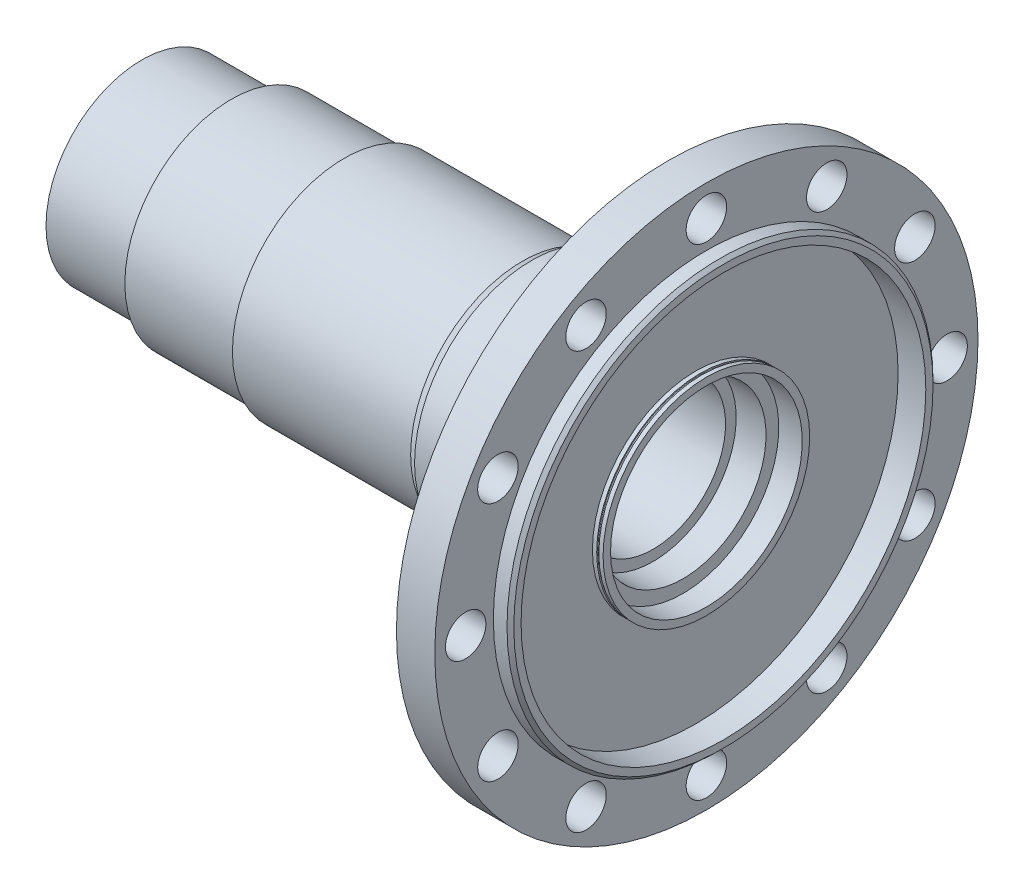
ISO-10303-21;
HEADER;
FILE_DESCRIPTION(('STEP AP214'),'2;1');
FILE_NAME('part.step','',(''),(''),'','','');
FILE_SCHEMA(('AUTOMOTIVE_DESIGN { 1 0 10303 214 1 1 1 1 }'));
ENDSEC;
DATA;
#1=APPLICATION_CONTEXT('core data for automotive mechanical design processes');
#2=APPLICATION_PROTOCOL_DEFINITION('international standard','automotive_design',2000,#1);
#3=PRODUCT_CONTEXT('',#1,'mechanical');
#4=PRODUCT('Part','Part','',(#3));
#5=PRODUCT_RELATED_PRODUCT_CATEGORY('part','',(#4));
#6=PRODUCT_DEFINITION_FORMATION('','',#4);
#7=PRODUCT_DEFINITION_CONTEXT('part definition',#1,'design');
#8=PRODUCT_DEFINITION('design','',#6,#7);
#9=PRODUCT_DEFINITION_SHAPE('','',#8);
#10=(LENGTH_UNIT() NAMED_UNIT(*) SI_UNIT(.MILLI.,.METRE.));
#11=(NAMED_UNIT(*) PLANE_ANGLE_UNIT() SI_UNIT($,.RADIAN.));
#12=(NAMED_UNIT(*) SI_UNIT($,.STERADIAN.) SOLID_ANGLE_UNIT());
#13=UNCERTAINTY_MEASURE_WITH_UNIT(LENGTH_MEASURE(1.E-05),#10,'distance_accuracy_value','');
#14=(GEOMETRIC_REPRESENTATION_CONTEXT(3) GLOBAL_UNCERTAINTY_ASSIGNED_CONTEXT((#13)) GLOBAL_UNIT_ASSIGNED_CONTEXT((#10,
#11,#12)) REPRESENTATION_CONTEXT('',''));
#15=CARTESIAN_POINT('',(0.,0.,0.));
#16=DIRECTION('',(0.,0.,1.));
#17=DIRECTION('',(1.,0.,0.));
#18=AXIS2_PLACEMENT_3D('',#15,#16,#17);
#19=CARTESIAN_POINT('',(265.,45.,0.));
#20=DIRECTION('',(1.,0.,0.));
#21=DIRECTION('',(0.,0.,-1.));
#22=AXIS2_PLACEMENT_3D('',#19,#20,#21);
#23=PLANE('',#22);
#24=CARTESIAN_POINT('',(265.,0.,0.));
#25=DIRECTION('',(-1.,0.,0.));
#26=DIRECTION('',(0.,0.,1.));
#27=AXIS2_PLACEMENT_3D('',#24,#25,#26);
#28=CIRCLE('',#27,45.);
#29=CARTESIAN_POINT('',(265.,0.,45.));
#30=VERTEX_POINT('',#29);
#31=EDGE_CURVE('E198',#30,#30,#28,.T.);
#32=ORIENTED_EDGE('',*,*,#31,.T.);
#33=EDGE_LOOP('',(#32));
#34=FACE_BOUND('',#33,.T.);
#35=CARTESIAN_POINT('',(265.,0.,0.));
#36=DIRECTION('',(-1.,0.,0.));
#37=DIRECTION('',(0.,0.,1.));
#38=AXIS2_PLACEMENT_3D('',#35,#36,#37);
#39=CIRCLE('',#38,48.5);
#40=CARTESIAN_POINT('',(265.,0.,48.5));
#41=VERTEX_POINT('',#40);
#42=EDGE_CURVE('E237',#41,#41,#39,.T.);
#43=ORIENTED_EDGE('',*,*,#42,.F.);
#44=EDGE_LOOP('',(#43));
#45=FACE_BOUND('',#44,.T.);
#46=ADVANCED_FACE('F50',(#34,#45),#23,.T.);
#47=CARTESIAN_POINT('',(0.,0.,0.));
#48=DIRECTION('',(1.,0.,0.));
#49=DIRECTION('',(0.,0.,-1.));
#50=AXIS2_PLACEMENT_3D('',#47,#48,#49);
#51=PLANE('',#50);
#52=CARTESIAN_POINT('',(0.,0.,0.));
#53=DIRECTION('',(-1.,0.,0.));
#54=DIRECTION('',(0.,0.,1.));
#55=AXIS2_PLACEMENT_3D('',#52,#53,#54);
#56=CIRCLE('',#55,31.);
#57=CARTESIAN_POINT('',(0.,0.,31.));
#58=VERTEX_POINT('',#57);
#59=EDGE_CURVE('E159',#58,#58,#56,.T.);
#60=ORIENTED_EDGE('',*,*,#59,.F.);
#61=EDGE_LOOP('',(#60));
#62=FACE_BOUND('',#61,.T.);
#63=CARTESIAN_POINT('',(0.,0.,0.));
#64=DIRECTION('',(-1.,0.,0.));
#65=DIRECTION('',(0.,0.,1.));
#66=AXIS2_PLACEMENT_3D('',#63,#64,#65);
#67=CIRCLE('',#66,45.);
#68=CARTESIAN_POINT('',(0.,0.,45.));
#69=VERTEX_POINT('',#68);
#70=EDGE_CURVE('E11',#69,#69,#67,.T.);
#71=ORIENTED_EDGE('',*,*,#70,.T.);
#72=EDGE_LOOP('',(#71));
#73=FACE_BOUND('',#72,.T.);
#74=ADVANCED_FACE('F53',(#62,#73),#51,.F.);
#75=CARTESIAN_POINT('',(0.,0.,0.));
#76=DIRECTION('',(-1.,0.,0.));
#77=DIRECTION('',(0.,0.,1.));
#78=AXIS2_PLACEMENT_3D('',#75,#76,#77);
#79=CYLINDRICAL_SURFACE('',#78,45.);
#80=ORIENTED_EDGE('',*,*,#70,.F.);
#81=EDGE_LOOP('',(#80));
#82=FACE_BOUND('',#81,.T.);
#83=CARTESIAN_POINT('',(42.,0.,0.));
#84=DIRECTION('',(-1.,0.,0.));
#85=DIRECTION('',(0.,0.,1.));
#86=AXIS2_PLACEMENT_3D('',#83,#84,#85);
#87=CIRCLE('',#86,45.);
#88=CARTESIAN_POINT('',(42.,0.,45.));
#89=VERTEX_POINT('',#88);
#90=EDGE_CURVE('E60',#89,#89,#87,.T.);
#91=ORIENTED_EDGE('',*,*,#90,.T.);
#92=EDGE_LOOP('',(#91));
#93=FACE_BOUND('',#92,.T.);
#94=ADVANCED_FACE('F380',(#82,#93),#79,.T.);
#95=CARTESIAN_POINT('',(42.,45.,0.));
#96=DIRECTION('',(1.,0.,0.));
#97=DIRECTION('',(0.,0.,-1.));
#98=AXIS2_PLACEMENT_3D('',#95,#96,#97);
#99=PLANE('',#98);
#100=ORIENTED_EDGE('',*,*,#90,.F.);
#101=EDGE_LOOP('',(#100));
#102=FACE_BOUND('',#101,.T.);
#103=CARTESIAN_POINT('',(42.,0.,0.));
#104=DIRECTION('',(-1.,0.,0.));
#105=DIRECTION('',(0.,0.,1.));
#106=AXIS2_PLACEMENT_3D('',#103,#104,#105);
#107=CIRCLE('',#106,50.);
#108=CARTESIAN_POINT('',(42.,0.,50.));
#109=VERTEX_POINT('',#108);
#110=EDGE_CURVE('E66',#109,#109,#107,.T.);
#111=ORIENTED_EDGE('',*,*,#110,.T.);
#112=EDGE_LOOP('',(#111));
#113=FACE_BOUND('',#112,.T.);
#114=ADVANCED_FACE('F456',(#102,#113),#99,.F.);
#115=CARTESIAN_POINT('',(0.,0.,0.));
#116=DIRECTION('',(-1.,0.,0.));
#117=DIRECTION('',(0.,0.,1.));
#118=AXIS2_PLACEMENT_3D('',#115,#116,#117);
#119=CYLINDRICAL_SURFACE('',#118,50.);
#120=ORIENTED_EDGE('',*,*,#110,.F.);
#121=EDGE_LOOP('',(#120));
#122=FACE_BOUND('',#121,.T.);
#123=CARTESIAN_POINT('',(95.,0.,0.));
#124=DIRECTION('',(-1.,0.,0.));
#125=DIRECTION('',(0.,0.,1.));
#126=AXIS2_PLACEMENT_3D('',#123,#124,#125);
#127=CIRCLE('',#126,50.);
#128=CARTESIAN_POINT('',(95.,0.,50.));
#129=VERTEX_POINT('',#128);
#130=EDGE_CURVE('E83',#129,#129,#127,.T.);
#131=ORIENTED_EDGE('',*,*,#130,.T.);
#132=EDGE_LOOP('',(#131));
#133=FACE_BOUND('',#132,.T.);
#134=ADVANCED_FACE('F453',(#122,#133),#119,.T.);
#135=CARTESIAN_POINT('',(95.,50.,0.));
#136=DIRECTION('',(1.,0.,0.));
#137=DIRECTION('',(0.,0.,-1.));
#138=AXIS2_PLACEMENT_3D('',#135,#136,#137);
#139=PLANE('',#138);
#140=ORIENTED_EDGE('',*,*,#130,.F.);
#141=EDGE_LOOP('',(#140));
#142=FACE_BOUND('',#141,.T.);
#143=CARTESIAN_POINT('',(95.,0.,0.));
#144=DIRECTION('',(-1.,0.,0.));
#145=DIRECTION('',(0.,0.,1.));
#146=AXIS2_PLACEMENT_3D('',#143,#144,#145);
#147=CIRCLE('',#146,52.5);
#148=CARTESIAN_POINT('',(95.,0.,52.5));
#149=VERTEX_POINT('',#148);
#150=EDGE_CURVE('E88',#149,#149,#147,.T.);
#151=ORIENTED_EDGE('',*,*,#150,.T.);
#152=EDGE_LOOP('',(#151));
#153=FACE_BOUND('',#152,.T.);
#154=ADVANCED_FACE('F450',(#142,#153),#139,.F.);
#155=CARTESIAN_POINT('',(0.,0.,0.));
#156=DIRECTION('',(-1.,0.,0.));
#157=DIRECTION('',(0.,0.,1.));
#158=AXIS2_PLACEMENT_3D('',#155,#156,#157);
#159=CYLINDRICAL_SURFACE('',#158,52.5);
#160=ORIENTED_EDGE('',*,*,#150,.F.);
#161=EDGE_LOOP('',(#160));
#162=FACE_BOUND('',#161,.T.);
#163=CARTESIAN_POINT('',(178.669872981078,0.,0.));
#164=DIRECTION('',(-1.,0.,0.));
#165=DIRECTION('',(0.,0.,1.));
#166=AXIS2_PLACEMENT_3D('',#163,#164,#165);
#167=CIRCLE('',#166,52.5);
#168=CARTESIAN_POINT('',(178.669872981078,0.,52.5));
#169=VERTEX_POINT('',#168);
#170=EDGE_CURVE('E93',#169,#169,#167,.T.);
#171=ORIENTED_EDGE('',*,*,#170,.T.);
#172=EDGE_LOOP('',(#171));
#173=FACE_BOUND('',#172,.T.);
#174=ADVANCED_FACE('F447',(#162,#173),#159,.T.);
#175=CARTESIAN_POINT('',(183.,0.,0.));
#176=DIRECTION('',(1.,0.,0.));
#177=DIRECTION('',(0.,0.,-1.));
#178=AXIS2_PLACEMENT_3D('',#175,#176,#177);
#179=CONICAL_SURFACE('',#178,55.,0.5235987755983);
#180=ORIENTED_EDGE('',*,*,#170,.F.);
#181=EDGE_LOOP('',(#180));
#182=FACE_BOUND('',#181,.T.);
#183=CARTESIAN_POINT('',(183.,0.,0.));
#184=DIRECTION('',(-1.,0.,0.));
#185=DIRECTION('',(0.,0.,1.));
#186=AXIS2_PLACEMENT_3D('',#183,#184,#185);
#187=CIRCLE('',#186,55.);
#188=CARTESIAN_POINT('',(183.,0.,55.));
#189=VERTEX_POINT('',#188);
#190=EDGE_CURVE('E101',#189,#189,#187,.T.);
#191=ORIENTED_EDGE('',*,*,#190,.T.);
#192=EDGE_LOOP('',(#191));
#193=FACE_BOUND('',#192,.T.);
#194=ADVANCED_FACE('F444',(#182,#193),#179,.T.);
#195=CARTESIAN_POINT('',(0.,0.,0.));
#196=DIRECTION('',(-1.,0.,0.));
#197=DIRECTION('',(0.,0.,1.));
#198=AXIS2_PLACEMENT_3D('',#195,#196,#197);
#199=CYLINDRICAL_SURFACE('',#198,55.);
#200=ORIENTED_EDGE('',*,*,#190,.F.);
#201=EDGE_LOOP('',(#200));
#202=FACE_BOUND('',#201,.T.);
#203=CARTESIAN_POINT('',(215.,0.,0.));
#204=DIRECTION('',(-1.,0.,0.));
#205=DIRECTION('',(0.,0.,1.));
#206=AXIS2_PLACEMENT_3D('',#203,#204,#205);
#207=CIRCLE('',#206,55.);
#208=CARTESIAN_POINT('',(215.,0.,55.));
#209=VERTEX_POINT('',#208);
#210=EDGE_CURVE('E105',#209,#209,#207,.T.);
#211=ORIENTED_EDGE('',*,*,#210,.T.);
#212=EDGE_LOOP('',(#211));
#213=FACE_BOUND('',#212,.T.);
#214=ADVANCED_FACE('F441',(#202,#213),#199,.T.);
#215=CARTESIAN_POINT('',(215.,55.,0.));
#216=DIRECTION('',(1.,0.,0.));
#217=DIRECTION('',(0.,0.,-1.));
#218=AXIS2_PLACEMENT_3D('',#215,#216,#217);
#219=PLANE('',#218);
#220=ORIENTED_EDGE('',*,*,#210,.F.);
#221=EDGE_LOOP('',(#220));
#222=FACE_BOUND('',#221,.T.);
#223=CARTESIAN_POINT('',(215.,0.,0.));
#224=DIRECTION('',(-1.,0.,0.));
#225=DIRECTION('',(0.,0.,1.));
#226=AXIS2_PLACEMENT_3D('',#223,#224,#225);
#227=CIRCLE('',#226,62.5);
#228=CARTESIAN_POINT('',(215.,0.,62.5));
#229=VERTEX_POINT('',#228);
#230=EDGE_CURVE('E110',#229,#229,#227,.T.);
#231=ORIENTED_EDGE('',*,*,#230,.T.);
#232=EDGE_LOOP('',(#231));
#233=FACE_BOUND('',#232,.T.);
#234=ADVANCED_FACE('F438',(#222,#233),#219,.F.);
#235=CARTESIAN_POINT('',(0.,0.,0.));
#236=DIRECTION('',(-1.,0.,0.));
#237=DIRECTION('',(0.,0.,1.));
#238=AXIS2_PLACEMENT_3D('',#235,#236,#237);
#239=CYLINDRICAL_SURFACE('',#238,62.5);
#240=ORIENTED_EDGE('',*,*,#230,.F.);
#241=EDGE_LOOP('',(#240));
#242=FACE_BOUND('',#241,.T.);
#243=CARTESIAN_POINT('',(239.,0.,0.));
#244=DIRECTION('',(-1.,0.,0.));
#245=DIRECTION('',(0.,0.,1.));
#246=AXIS2_PLACEMENT_3D('',#243,#244,#245);
#247=CIRCLE('',#246,62.5);
#248=CARTESIAN_POINT('',(239.,0.,62.5));
#249=VERTEX_POINT('',#248);
#250=EDGE_CURVE('E115',#249,#249,#247,.T.);
#251=ORIENTED_EDGE('',*,*,#250,.T.);
#252=EDGE_LOOP('',(#251));
#253=FACE_BOUND('',#252,.T.);
#254=ADVANCED_FACE('F435',(#242,#253),#239,.T.);
#255=CARTESIAN_POINT('',(239.,62.5,0.));
#256=DIRECTION('',(1.,0.,0.));
#257=DIRECTION('',(0.,0.,-1.));
#258=AXIS2_PLACEMENT_3D('',#255,#256,#257);
#259=PLANE('',#258);
#260=ORIENTED_EDGE('',*,*,#250,.F.);
#261=EDGE_LOOP('',(#260));
#262=FACE_BOUND('',#261,.T.);
#263=CARTESIAN_POINT('',(239.,0.,0.));
#264=DIRECTION('',(-1.,0.,0.));
#265=DIRECTION('',(0.,0.,1.));
#266=AXIS2_PLACEMENT_3D('',#263,#264,#265);
#267=CIRCLE('',#266,100.);
#268=CARTESIAN_POINT('',(239.,0.,100.));
#269=VERTEX_POINT('',#268);
#270=EDGE_CURVE('E123',#269,#269,#267,.T.);
#271=ORIENTED_EDGE('',*,*,#270,.T.);
#272=EDGE_LOOP('',(#271));
#273=FACE_BOUND('',#272,.T.);
#274=ADVANCED_FACE('F432',(#262,#273),#259,.F.);
#275=CARTESIAN_POINT('',(0.,0.,0.));
#276=DIRECTION('',(-1.,0.,0.));
#277=DIRECTION('',(0.,0.,1.));
#278=AXIS2_PLACEMENT_3D('',#275,#276,#277);
#279=CYLINDRICAL_SURFACE('',#278,100.);
#280=ORIENTED_EDGE('',*,*,#270,.F.);
#281=EDGE_LOOP('',(#280));
#282=FACE_BOUND('',#281,.T.);
#283=CARTESIAN_POINT('',(247.,0.,0.));
#284=DIRECTION('',(-1.,0.,0.));
#285=DIRECTION('',(0.,0.,1.));
#286=AXIS2_PLACEMENT_3D('',#283,#284,#285);
#287=CIRCLE('',#286,100.);
#288=CARTESIAN_POINT('',(247.,0.,100.));
#289=VERTEX_POINT('',#288);
#290=EDGE_CURVE('E127',#289,#289,#287,.T.);
#291=ORIENTED_EDGE('',*,*,#290,.T.);
#292=EDGE_LOOP('',(#291));
#293=FACE_BOUND('',#292,.T.);
#294=ADVANCED_FACE('F429',(#282,#293),#279,.T.);
#295=CARTESIAN_POINT('',(247.,100.,0.));
#296=DIRECTION('',(1.,0.,0.));
#297=DIRECTION('',(0.,0.,-1.));
#298=AXIS2_PLACEMENT_3D('',#295,#296,#297);
#299=PLANE('',#298);
#300=CARTESIAN_POINT('',(247.,97.8608706276416,-56.5));
#301=DIRECTION('',(1.,0.,0.));
#302=DIRECTION('',(0.,0.,-1.));
#303=AXIS2_PLACEMENT_3D('',#300,#301,#302);
#304=CIRCLE('',#303,9.5);
#305=CARTESIAN_POINT('',(247.,97.8608706276416,-66.));
#306=VERTEX_POINT('',#305);
#307=EDGE_CURVE('E296',#306,#306,#304,.F.);
#308=ORIENTED_EDGE('',*,*,#307,.F.);
#309=EDGE_LOOP('',(#308));
#310=FACE_BOUND('',#309,.T.);
#311=CARTESIAN_POINT('',(247.,56.4999999999999,-97.8608706276416));
#312=DIRECTION('',(1.,0.,0.));
#313=DIRECTION('',(0.,0.,-1.));
#314=AXIS2_PLACEMENT_3D('',#311,#312,#313);
#315=CIRCLE('',#314,9.49999999999999);
#316=CARTESIAN_POINT('',(247.,56.4999999999999,-107.360870627642));
#317=VERTEX_POINT('',#316);
#318=EDGE_CURVE('E291',#317,#317,#315,.F.);
#319=ORIENTED_EDGE('',*,*,#318,.F.);
#320=EDGE_LOOP('',(#319));
#321=FACE_BOUND('',#320,.T.);
#322=CARTESIAN_POINT('',(247.,0.,-113.));
#323=DIRECTION('',(1.,0.,0.));
#324=DIRECTION('',(0.,0.,-1.));
#325=AXIS2_PLACEMENT_3D('',#322,#323,#324);
#326=CIRCLE('',#325,9.49999999999999);
#327=CARTESIAN_POINT('',(247.,0.,-122.5));
#328=VERTEX_POINT('',#327);
#329=EDGE_CURVE('E286',#328,#328,#326,.F.);
#330=ORIENTED_EDGE('',*,*,#329,.F.);
#331=EDGE_LOOP('',(#330));
#332=FACE_BOUND('',#331,.T.);
#333=CARTESIAN_POINT('',(247.,-56.5,-97.8608706276415));
#334=DIRECTION('',(1.,0.,0.));
#335=DIRECTION('',(0.,0.,-1.));
#336=AXIS2_PLACEMENT_3D('',#333,#334,#335);
#337=CIRCLE('',#336,9.49999999999999);
#338=CARTESIAN_POINT('',(247.,-56.5,-107.360870627642));
#339=VERTEX_POINT('',#338);
#340=EDGE_CURVE('E281',#339,#339,#337,.F.);
#341=ORIENTED_EDGE('',*,*,#340,.F.);
#342=EDGE_LOOP('',(#341));
#343=FACE_BOUND('',#342,.T.);
#344=CARTESIAN_POINT('',(247.,-97.8608706276416,-56.5));
#345=DIRECTION('',(1.,0.,0.));
#346=DIRECTION('',(0.,0.,-1.));
#347=AXIS2_PLACEMENT_3D('',#344,#345,#346);
#348=CIRCLE('',#347,9.5);
#349=CARTESIAN_POINT('',(247.,-97.8608706276416,-66.));
#350=VERTEX_POINT('',#349);
#351=EDGE_CURVE('E276',#350,#350,#348,.F.);
#352=ORIENTED_EDGE('',*,*,#351,.F.);
#353=EDGE_LOOP('',(#352));
#354=FACE_BOUND('',#353,.T.);
#355=CARTESIAN_POINT('',(247.,-113.,0.));
#356=DIRECTION('',(1.,0.,0.));
#357=DIRECTION('',(0.,0.,-1.));
#358=AXIS2_PLACEMENT_3D('',#355,#356,#357);
#359=CIRCLE('',#358,9.5);
#360=CARTESIAN_POINT('',(247.,-113.,-9.49999999999998));
#361=VERTEX_POINT('',#360);
#362=EDGE_CURVE('E271',#361,#361,#359,.F.);
#363=ORIENTED_EDGE('',*,*,#362,.F.);
#364=EDGE_LOOP('',(#363));
#365=FACE_BOUND('',#364,.T.);
#366=CARTESIAN_POINT('',(247.,-97.8608706276415,56.5));
#367=DIRECTION('',(1.,0.,0.));
#368=DIRECTION('',(0.,0.,-1.));
#369=AXIS2_PLACEMENT_3D('',#366,#367,#368);
#370=CIRCLE('',#369,9.5);
#371=CARTESIAN_POINT('',(247.,-97.8608706276415,47.));
#372=VERTEX_POINT('',#371);
#373=EDGE_CURVE('E266',#372,#372,#370,.F.);
#374=ORIENTED_EDGE('',*,*,#373,.F.);
#375=EDGE_LOOP('',(#374));
#376=FACE_BOUND('',#375,.T.);
#377=CARTESIAN_POINT('',(247.,-56.5,97.8608706276416));
#378=DIRECTION('',(1.,0.,0.));
#379=DIRECTION('',(0.,0.,-1.));
#380=AXIS2_PLACEMENT_3D('',#377,#378,#379);
#381=CIRCLE('',#380,9.49999999999999);
#382=CARTESIAN_POINT('',(247.,-56.5,88.3608706276416));
#383=VERTEX_POINT('',#382);
#384=EDGE_CURVE('E261',#383,#383,#381,.F.);
#385=ORIENTED_EDGE('',*,*,#384,.F.);
#386=EDGE_LOOP('',(#385));
#387=FACE_BOUND('',#386,.T.);
#388=CARTESIAN_POINT('',(247.,0.,113.));
#389=DIRECTION('',(1.,0.,0.));
#390=DIRECTION('',(0.,0.,-1.));
#391=AXIS2_PLACEMENT_3D('',#388,#389,#390);
#392=CIRCLE('',#391,9.49999999999999);
#393=CARTESIAN_POINT('',(247.,0.,103.5));
#394=VERTEX_POINT('',#393);
#395=EDGE_CURVE('E256',#394,#394,#392,.F.);
#396=ORIENTED_EDGE('',*,*,#395,.F.);
#397=EDGE_LOOP('',(#396));
#398=FACE_BOUND('',#397,.T.);
#399=CARTESIAN_POINT('',(247.,56.5,97.8608706276416));
#400=DIRECTION('',(1.,0.,0.));
#401=DIRECTION('',(0.,0.,-1.));
#402=AXIS2_PLACEMENT_3D('',#399,#400,#401);
#403=CIRCLE('',#402,9.49999999999999);
#404=CARTESIAN_POINT('',(247.,56.5,88.3608706276416));
#405=VERTEX_POINT('',#404);
#406=EDGE_CURVE('E251',#405,#405,#403,.F.);
#407=ORIENTED_EDGE('',*,*,#406,.F.);
#408=EDGE_LOOP('',(#407));
#409=FACE_BOUND('',#408,.T.);
#410=CARTESIAN_POINT('',(247.,97.8608706276416,56.5));
#411=DIRECTION('',(1.,0.,0.));
#412=DIRECTION('',(0.,0.,-1.));
#413=AXIS2_PLACEMENT_3D('',#410,#411,#412);
#414=CIRCLE('',#413,9.5);
#415=CARTESIAN_POINT('',(247.,97.8608706276416,47.));
#416=VERTEX_POINT('',#415);
#417=EDGE_CURVE('E246',#416,#416,#414,.F.);
#418=ORIENTED_EDGE('',*,*,#417,.F.);
#419=EDGE_LOOP('',(#418));
#420=FACE_BOUND('',#419,.T.);
#421=CARTESIAN_POINT('',(247.,113.,0.));
#422=DIRECTION('',(1.,0.,0.));
#423=DIRECTION('',(0.,0.,-1.));
#424=AXIS2_PLACEMENT_3D('',#421,#422,#423);
#425=CIRCLE('',#424,9.5);
#426=CARTESIAN_POINT('',(247.,113.,-9.50000000000001));
#427=VERTEX_POINT('',#426);
#428=EDGE_CURVE('E242',#427,#427,#425,.F.);
#429=ORIENTED_EDGE('',*,*,#428,.F.);
#430=EDGE_LOOP('',(#429));
#431=FACE_BOUND('',#430,.T.);
#432=ORIENTED_EDGE('',*,*,#290,.F.);
#433=EDGE_LOOP('',(#432));
#434=FACE_BOUND('',#433,.T.);
#435=CARTESIAN_POINT('',(247.,0.,0.));
#436=DIRECTION('',(-1.,0.,0.));
#437=DIRECTION('',(0.,0.,1.));
#438=AXIS2_PLACEMENT_3D('',#435,#436,#437);
#439=CIRCLE('',#438,127.5);
#440=CARTESIAN_POINT('',(247.,0.,127.5));
#441=VERTEX_POINT('',#440);
#442=EDGE_CURVE('E132',#441,#441,#439,.T.);
#443=ORIENTED_EDGE('',*,*,#442,.T.);
#444=EDGE_LOOP('',(#443));
#445=FACE_BOUND('',#444,.T.);
#446=ADVANCED_FACE('F426',(#310,#321,#332,#343,#354,#365,#376,#387,#398,#409,#420,#431,#434,
#445),#299,.F.);
#447=CARTESIAN_POINT('',(0.,0.,0.));
#448=DIRECTION('',(-1.,0.,0.));
#449=DIRECTION('',(0.,0.,1.));
#450=AXIS2_PLACEMENT_3D('',#447,#448,#449);
#451=CYLINDRICAL_SURFACE('',#450,127.5);
#452=ORIENTED_EDGE('',*,*,#442,.F.);
#453=EDGE_LOOP('',(#452));
#454=FACE_BOUND('',#453,.T.);
#455=CARTESIAN_POINT('',(265.,0.,0.));
#456=DIRECTION('',(-1.,0.,0.));
#457=DIRECTION('',(0.,0.,1.));
#458=AXIS2_PLACEMENT_3D('',#455,#456,#457);
#459=CIRCLE('',#458,127.5);
#460=CARTESIAN_POINT('',(265.,0.,127.5));
#461=VERTEX_POINT('',#460);
#462=EDGE_CURVE('E137',#461,#461,#459,.T.);
#463=ORIENTED_EDGE('',*,*,#462,.T.);
#464=EDGE_LOOP('',(#463));
#465=FACE_BOUND('',#464,.T.);
#466=ADVANCED_FACE('F313',(#454,#465),#451,.T.);
#467=CARTESIAN_POINT('',(265.,127.5,0.));
#468=DIRECTION('',(-1.,0.,0.));
#469=DIRECTION('',(0.,0.,1.));
#470=AXIS2_PLACEMENT_3D('',#467,#468,#469);
#471=PLANE('',#470);
#472=CARTESIAN_POINT('',(265.,97.8608706276416,-56.5));
#473=DIRECTION('',(-1.,0.,0.));
#474=DIRECTION('',(0.,0.,1.));
#475=AXIS2_PLACEMENT_3D('',#472,#473,#474);
#476=CIRCLE('',#475,9.5);
#477=CARTESIAN_POINT('',(265.,97.8608706276416,-47.));
#478=VERTEX_POINT('',#477);
#479=EDGE_CURVE('E55',#478,#478,#476,.F.);
#480=ORIENTED_EDGE('',*,*,#479,.F.);
#481=EDGE_LOOP('',(#480));
#482=FACE_BOUND('',#481,.T.);
#483=CARTESIAN_POINT('',(265.,56.4999999999999,-97.8608706276416));
#484=DIRECTION('',(-1.,0.,0.));
#485=DIRECTION('',(0.,0.,1.));
#486=AXIS2_PLACEMENT_3D('',#483,#484,#485);
#487=CIRCLE('',#486,9.49999999999999);
#488=CARTESIAN_POINT('',(265.,56.4999999999999,-88.3608706276416));
#489=VERTEX_POINT('',#488);
#490=EDGE_CURVE('E295',#489,#489,#487,.F.);
#491=ORIENTED_EDGE('',*,*,#490,.F.);
#492=EDGE_LOOP('',(#491));
#493=FACE_BOUND('',#492,.T.);
#494=CARTESIAN_POINT('',(265.,0.,-113.));
#495=DIRECTION('',(-1.,0.,0.));
#496=DIRECTION('',(0.,0.,1.));
#497=AXIS2_PLACEMENT_3D('',#494,#495,#496);
#498=CIRCLE('',#497,9.49999999999999);
#499=CARTESIAN_POINT('',(265.,0.,-103.5));
#500=VERTEX_POINT('',#499);
#501=EDGE_CURVE('E290',#500,#500,#498,.F.);
#502=ORIENTED_EDGE('',*,*,#501,.F.);
#503=EDGE_LOOP('',(#502));
#504=FACE_BOUND('',#503,.T.);
#505=CARTESIAN_POINT('',(265.,-56.5,-97.8608706276415));
#506=DIRECTION('',(-1.,0.,0.));
#507=DIRECTION('',(0.,0.,1.));
#508=AXIS2_PLACEMENT_3D('',#505,#506,#507);
#509=CIRCLE('',#508,9.49999999999999);
#510=CARTESIAN_POINT('',(265.,-56.5,-88.3608706276415));
#511=VERTEX_POINT('',#510);
#512=EDGE_CURVE('E285',#511,#511,#509,.F.);
#513=ORIENTED_EDGE('',*,*,#512,.F.);
#514=EDGE_LOOP('',(#513));
#515=FACE_BOUND('',#514,.T.);
#516=CARTESIAN_POINT('',(265.,-97.8608706276416,-56.5));
#517=DIRECTION('',(-1.,0.,0.));
#518=DIRECTION('',(0.,0.,1.));
#519=AXIS2_PLACEMENT_3D('',#516,#517,#518);
#520=CIRCLE('',#519,9.5);
#521=CARTESIAN_POINT('',(265.,-97.8608706276416,-47.));
#522=VERTEX_POINT('',#521);
#523=EDGE_CURVE('E280',#522,#522,#520,.F.);
#524=ORIENTED_EDGE('',*,*,#523,.F.);
#525=EDGE_LOOP('',(#524));
#526=FACE_BOUND('',#525,.T.);
#527=CARTESIAN_POINT('',(265.,-113.,0.));
#528=DIRECTION('',(-1.,0.,0.));
#529=DIRECTION('',(0.,0.,1.));
#530=AXIS2_PLACEMENT_3D('',#527,#528,#529);
#531=CIRCLE('',#530,9.5);
#532=CARTESIAN_POINT('',(265.,-113.,9.50000000000002));
#533=VERTEX_POINT('',#532);
#534=EDGE_CURVE('E275',#533,#533,#531,.F.);
#535=ORIENTED_EDGE('',*,*,#534,.F.);
#536=EDGE_LOOP('',(#535));
#537=FACE_BOUND('',#536,.T.);
#538=CARTESIAN_POINT('',(265.,-97.8608706276415,56.5));
#539=DIRECTION('',(-1.,0.,0.));
#540=DIRECTION('',(0.,0.,1.));
#541=AXIS2_PLACEMENT_3D('',#538,#539,#540);
#542=CIRCLE('',#541,9.5);
#543=CARTESIAN_POINT('',(265.,-97.8608706276415,66.0000000000001));
#544=VERTEX_POINT('',#543);
#545=EDGE_CURVE('E270',#544,#544,#542,.F.);
#546=ORIENTED_EDGE('',*,*,#545,.F.);
#547=EDGE_LOOP('',(#546));
#548=FACE_BOUND('',#547,.T.);
#549=CARTESIAN_POINT('',(265.,-56.5,97.8608706276416));
#550=DIRECTION('',(-1.,0.,0.));
#551=DIRECTION('',(0.,0.,1.));
#552=AXIS2_PLACEMENT_3D('',#549,#550,#551);
#553=CIRCLE('',#552,9.49999999999999);
#554=CARTESIAN_POINT('',(265.,-56.5,107.360870627642));
#555=VERTEX_POINT('',#554);
#556=EDGE_CURVE('E265',#555,#555,#553,.F.);
#557=ORIENTED_EDGE('',*,*,#556,.F.);
#558=EDGE_LOOP('',(#557));
#559=FACE_BOUND('',#558,.T.);
#560=CARTESIAN_POINT('',(265.,0.,113.));
#561=DIRECTION('',(-1.,0.,0.));
#562=DIRECTION('',(0.,0.,1.));
#563=AXIS2_PLACEMENT_3D('',#560,#561,#562);
#564=CIRCLE('',#563,9.49999999999999);
#565=CARTESIAN_POINT('',(265.,0.,122.5));
#566=VERTEX_POINT('',#565);
#567=EDGE_CURVE('E260',#566,#566,#564,.F.);
#568=ORIENTED_EDGE('',*,*,#567,.F.);
#569=EDGE_LOOP('',(#568));
#570=FACE_BOUND('',#569,.T.);
#571=CARTESIAN_POINT('',(265.,56.5,97.8608706276416));
#572=DIRECTION('',(-1.,0.,0.));
#573=DIRECTION('',(0.,0.,1.));
#574=AXIS2_PLACEMENT_3D('',#571,#572,#573);
#575=CIRCLE('',#574,9.49999999999999);
#576=CARTESIAN_POINT('',(265.,56.5,107.360870627642));
#577=VERTEX_POINT('',#576);
#578=EDGE_CURVE('E255',#577,#577,#575,.F.);
#579=ORIENTED_EDGE('',*,*,#578,.F.);
#580=EDGE_LOOP('',(#579));
#581=FACE_BOUND('',#580,.T.);
#582=CARTESIAN_POINT('',(265.,97.8608706276416,56.5));
#583=DIRECTION('',(-1.,0.,0.));
#584=DIRECTION('',(0.,0.,1.));
#585=AXIS2_PLACEMENT_3D('',#582,#583,#584);
#586=CIRCLE('',#585,9.5);
#587=CARTESIAN_POINT('',(265.,97.8608706276416,66.));
#588=VERTEX_POINT('',#587);
#589=EDGE_CURVE('E250',#588,#588,#586,.F.);
#590=ORIENTED_EDGE('',*,*,#589,.F.);
#591=EDGE_LOOP('',(#590));
#592=FACE_BOUND('',#591,.T.);
#593=CARTESIAN_POINT('',(265.,113.,0.));
#594=DIRECTION('',(-1.,0.,0.));
#595=DIRECTION('',(0.,0.,1.));
#596=AXIS2_PLACEMENT_3D('',#593,#594,#595);
#597=CIRCLE('',#596,9.5);
#598=CARTESIAN_POINT('',(265.,113.,9.49999999999999));
#599=VERTEX_POINT('',#598);
#600=EDGE_CURVE('E72',#599,#599,#597,.F.);
#601=ORIENTED_EDGE('',*,*,#600,.F.);
#602=EDGE_LOOP('',(#601));
#603=FACE_BOUND('',#602,.T.);
#604=ORIENTED_EDGE('',*,*,#462,.F.);
#605=EDGE_LOOP('',(#604));
#606=FACE_BOUND('',#605,.T.);
#607=CARTESIAN_POINT('',(265.,0.,0.));
#608=DIRECTION('',(-1.,0.,0.));
#609=DIRECTION('',(0.,0.,1.));
#610=AXIS2_PLACEMENT_3D('',#607,#608,#609);
#611=CIRCLE('',#610,100.);
#612=CARTESIAN_POINT('',(265.,0.,100.));
#613=VERTEX_POINT('',#612);
#614=EDGE_CURVE('E145',#613,#613,#611,.T.);
#615=ORIENTED_EDGE('',*,*,#614,.T.);
#616=EDGE_LOOP('',(#615));
#617=FACE_BOUND('',#616,.T.);
#618=ADVANCED_FACE('F309',(#482,#493,#504,#515,#526,#537,#548,#559,#570,#581,#592,#603,#606,
#617),#471,.F.);
#619=CARTESIAN_POINT('',(0.,0.,0.));
#620=DIRECTION('',(-1.,0.,0.));
#621=DIRECTION('',(0.,0.,1.));
#622=AXIS2_PLACEMENT_3D('',#619,#620,#621);
#623=CYLINDRICAL_SURFACE('',#622,100.);
#624=ORIENTED_EDGE('',*,*,#614,.F.);
#625=EDGE_LOOP('',(#624));
#626=FACE_BOUND('',#625,.T.);
#627=CARTESIAN_POINT('',(271.4,0.,0.));
#628=DIRECTION('',(-1.,0.,0.));
#629=DIRECTION('',(0.,0.,1.));
#630=AXIS2_PLACEMENT_3D('',#627,#628,#629);
#631=CIRCLE('',#630,100.);
#632=CARTESIAN_POINT('',(271.4,0.,100.));
#633=VERTEX_POINT('',#632);
#634=EDGE_CURVE('E149',#633,#633,#631,.T.);
#635=ORIENTED_EDGE('',*,*,#634,.T.);
#636=EDGE_LOOP('',(#635));
#637=FACE_BOUND('',#636,.T.);
#638=ADVANCED_FACE('F312',(#626,#637),#623,.T.);
#639=CARTESIAN_POINT('',(273.,0.,0.));
#640=DIRECTION('',(-1.,0.,0.));
#641=DIRECTION('',(0.,0.,1.));
#642=AXIS2_PLACEMENT_3D('',#639,#640,#641);
#643=CONICAL_SURFACE('',#642,98.4,0.785398163397435);
#644=ORIENTED_EDGE('',*,*,#634,.F.);
#645=EDGE_LOOP('',(#644));
#646=FACE_BOUND('',#645,.T.);
#647=CARTESIAN_POINT('',(273.,0.,0.));
#648=DIRECTION('',(-1.,0.,0.));
#649=DIRECTION('',(0.,0.,1.));
#650=AXIS2_PLACEMENT_3D('',#647,#648,#649);
#651=CIRCLE('',#650,98.4);
#652=CARTESIAN_POINT('',(273.,0.,98.4));
#653=VERTEX_POINT('',#652);
#654=EDGE_CURVE('E154',#653,#653,#651,.T.);
#655=ORIENTED_EDGE('',*,*,#654,.T.);
#656=EDGE_LOOP('',(#655));
#657=FACE_BOUND('',#656,.T.);
#658=ADVANCED_FACE('F354',(#646,#657),#643,.T.);
#659=CARTESIAN_POINT('',(273.,98.4,0.));
#660=DIRECTION('',(-1.,0.,0.));
#661=DIRECTION('',(0.,0.,1.));
#662=AXIS2_PLACEMENT_3D('',#659,#660,#661);
#663=PLANE('',#662);
#664=CARTESIAN_POINT('',(273.,0.,0.));
#665=DIRECTION('',(-1.,0.,0.));
#666=DIRECTION('',(0.,0.,1.));
#667=AXIS2_PLACEMENT_3D('',#664,#665,#666);
#668=CIRCLE('',#667,95.);
#669=CARTESIAN_POINT('',(273.,0.,95.));
#670=VERTEX_POINT('',#669);
#671=EDGE_CURVE('E203',#670,#670,#668,.T.);
#672=ORIENTED_EDGE('',*,*,#671,.T.);
#673=EDGE_LOOP('',(#672));
#674=FACE_BOUND('',#673,.T.);
#675=ORIENTED_EDGE('',*,*,#654,.F.);
#676=EDGE_LOOP('',(#675));
#677=FACE_BOUND('',#676,.T.);
#678=ADVANCED_FACE('F360',(#674,#677),#663,.F.);
#679=CARTESIAN_POINT('',(0.,0.,0.));
#680=DIRECTION('',(-1.,0.,0.));
#681=DIRECTION('',(0.,0.,1.));
#682=AXIS2_PLACEMENT_3D('',#679,#680,#681);
#683=CYLINDRICAL_SURFACE('',#682,31.);
#684=ORIENTED_EDGE('',*,*,#59,.T.);
#685=EDGE_LOOP('',(#684));
#686=FACE_BOUND('',#685,.T.);
#687=CARTESIAN_POINT('',(203.5,0.,0.));
#688=DIRECTION('',(-1.,0.,0.));
#689=DIRECTION('',(0.,0.,1.));
#690=AXIS2_PLACEMENT_3D('',#687,#688,#689);
#691=CIRCLE('',#690,31.);
#692=CARTESIAN_POINT('',(203.5,0.,31.));
#693=VERTEX_POINT('',#692);
#694=EDGE_CURVE('E167',#693,#693,#691,.T.);
#695=ORIENTED_EDGE('',*,*,#694,.F.);
#696=EDGE_LOOP('',(#695));
#697=FACE_BOUND('',#696,.T.);
#698=ADVANCED_FACE('F365',(#686,#697),#683,.F.);
#699=CARTESIAN_POINT('',(203.5,31.,0.));
#700=DIRECTION('',(1.,0.,0.));
#701=DIRECTION('',(0.,0.,-1.));
#702=AXIS2_PLACEMENT_3D('',#699,#700,#701);
#703=PLANE('',#702);
#704=ORIENTED_EDGE('',*,*,#694,.T.);
#705=EDGE_LOOP('',(#704));
#706=FACE_BOUND('',#705,.T.);
#707=CARTESIAN_POINT('',(203.5,0.,0.));
#708=DIRECTION('',(-1.,0.,0.));
#709=DIRECTION('',(0.,0.,1.));
#710=AXIS2_PLACEMENT_3D('',#707,#708,#709);
#711=CIRCLE('',#710,34.);
#712=CARTESIAN_POINT('',(203.5,0.,34.));
#713=VERTEX_POINT('',#712);
#714=EDGE_CURVE('E171',#713,#713,#711,.T.);
#715=ORIENTED_EDGE('',*,*,#714,.F.);
#716=EDGE_LOOP('',(#715));
#717=FACE_BOUND('',#716,.T.);
#718=ADVANCED_FACE('F370',(#706,#717),#703,.T.);
#719=CARTESIAN_POINT('',(0.,0.,0.));
#720=DIRECTION('',(-1.,0.,0.));
#721=DIRECTION('',(0.,0.,1.));
#722=AXIS2_PLACEMENT_3D('',#719,#720,#721);
#723=CYLINDRICAL_SURFACE('',#722,34.);
#724=ORIENTED_EDGE('',*,*,#714,.T.);
#725=EDGE_LOOP('',(#724));
#726=FACE_BOUND('',#725,.T.);
#727=CARTESIAN_POINT('',(240.,0.,0.));
#728=DIRECTION('',(-1.,0.,0.));
#729=DIRECTION('',(0.,0.,1.));
#730=AXIS2_PLACEMENT_3D('',#727,#728,#729);
#731=CIRCLE('',#730,34.);
#732=CARTESIAN_POINT('',(240.,0.,34.));
#733=VERTEX_POINT('',#732);
#734=EDGE_CURVE('E176',#733,#733,#731,.T.);
#735=ORIENTED_EDGE('',*,*,#734,.F.);
#736=EDGE_LOOP('',(#735));
#737=FACE_BOUND('',#736,.T.);
#738=ADVANCED_FACE('F409',(#726,#737),#723,.F.);
#739=CARTESIAN_POINT('',(240.,34.,0.));
#740=DIRECTION('',(1.,0.,0.));
#741=DIRECTION('',(0.,0.,-1.));
#742=AXIS2_PLACEMENT_3D('',#739,#740,#741);
#743=PLANE('',#742);
#744=ORIENTED_EDGE('',*,*,#734,.T.);
#745=EDGE_LOOP('',(#744));
#746=FACE_BOUND('',#745,.T.);
#747=CARTESIAN_POINT('',(240.,0.,0.));
#748=DIRECTION('',(-1.,0.,0.));
#749=DIRECTION('',(0.,0.,1.));
#750=AXIS2_PLACEMENT_3D('',#747,#748,#749);
#751=CIRCLE('',#750,39.);
#752=CARTESIAN_POINT('',(240.,0.,39.));
#753=VERTEX_POINT('',#752);
#754=EDGE_CURVE('E181',#753,#753,#751,.T.);
#755=ORIENTED_EDGE('',*,*,#754,.F.);
#756=EDGE_LOOP('',(#755));
#757=FACE_BOUND('',#756,.T.);
#758=ADVANCED_FACE('F404',(#746,#757),#743,.T.);
#759=CARTESIAN_POINT('',(0.,0.,0.));
#760=DIRECTION('',(-1.,0.,0.));
#761=DIRECTION('',(0.,0.,1.));
#762=AXIS2_PLACEMENT_3D('',#759,#760,#761);
#763=CYLINDRICAL_SURFACE('',#762,39.);
#764=ORIENTED_EDGE('',*,*,#754,.T.);
#765=EDGE_LOOP('',(#764));
#766=FACE_BOUND('',#765,.T.);
#767=CARTESIAN_POINT('',(254.,0.,0.));
#768=DIRECTION('',(-1.,0.,0.));
#769=DIRECTION('',(0.,0.,1.));
#770=AXIS2_PLACEMENT_3D('',#767,#768,#769);
#771=CIRCLE('',#770,39.);
#772=CARTESIAN_POINT('',(254.,0.,39.));
#773=VERTEX_POINT('',#772);
#774=EDGE_CURVE('E189',#773,#773,#771,.T.);
#775=ORIENTED_EDGE('',*,*,#774,.F.);
#776=EDGE_LOOP('',(#775));
#777=FACE_BOUND('',#776,.T.);
#778=ADVANCED_FACE('F399',(#766,#777),#763,.F.);
#779=CARTESIAN_POINT('',(254.,39.,0.));
#780=DIRECTION('',(1.,0.,0.));
#781=DIRECTION('',(0.,0.,-1.));
#782=AXIS2_PLACEMENT_3D('',#779,#780,#781);
#783=PLANE('',#782);
#784=ORIENTED_EDGE('',*,*,#774,.T.);
#785=EDGE_LOOP('',(#784));
#786=FACE_BOUND('',#785,.T.);
#787=CARTESIAN_POINT('',(254.,0.,0.));
#788=DIRECTION('',(-1.,0.,0.));
#789=DIRECTION('',(0.,0.,1.));
#790=AXIS2_PLACEMENT_3D('',#787,#788,#789);
#791=CIRCLE('',#790,45.);
#792=CARTESIAN_POINT('',(254.,0.,45.));
#793=VERTEX_POINT('',#792);
#794=EDGE_CURVE('E193',#793,#793,#791,.T.);
#795=ORIENTED_EDGE('',*,*,#794,.F.);
#796=EDGE_LOOP('',(#795));
#797=FACE_BOUND('',#796,.T.);
#798=ADVANCED_FACE('F394',(#786,#797),#783,.T.);
#799=CARTESIAN_POINT('',(0.,0.,0.));
#800=DIRECTION('',(-1.,0.,0.));
#801=DIRECTION('',(0.,0.,1.));
#802=AXIS2_PLACEMENT_3D('',#799,#800,#801);
#803=CYLINDRICAL_SURFACE('',#802,45.);
#804=ORIENTED_EDGE('',*,*,#794,.T.);
#805=EDGE_LOOP('',(#804));
#806=FACE_BOUND('',#805,.T.);
#807=ORIENTED_EDGE('',*,*,#31,.F.);
#808=EDGE_LOOP('',(#807));
#809=FACE_BOUND('',#808,.T.);
#810=ADVANCED_FACE('F390',(#806,#809),#803,.F.);
#811=CARTESIAN_POINT('',(0.,0.,0.));
#812=DIRECTION('',(-1.,0.,0.));
#813=DIRECTION('',(0.,0.,1.));
#814=AXIS2_PLACEMENT_3D('',#811,#812,#813);
#815=CYLINDRICAL_SURFACE('',#814,95.);
#816=ORIENTED_EDGE('',*,*,#671,.F.);
#817=EDGE_LOOP('',(#816));
#818=FACE_BOUND('',#817,.T.);
#819=CARTESIAN_POINT('',(260.,0.,0.));
#820=DIRECTION('',(-1.,0.,0.));
#821=DIRECTION('',(0.,0.,1.));
#822=AXIS2_PLACEMENT_3D('',#819,#820,#821);
#823=CIRCLE('',#822,95.);
#824=CARTESIAN_POINT('',(260.,0.,95.));
#825=VERTEX_POINT('',#824);
#826=EDGE_CURVE('E215',#825,#825,#823,.T.);
#827=ORIENTED_EDGE('',*,*,#826,.T.);
#828=EDGE_LOOP('',(#827));
#829=FACE_BOUND('',#828,.T.);
#830=ADVANCED_FACE('F387',(#818,#829),#815,.F.);
#831=CARTESIAN_POINT('',(0.,0.,0.));
#832=DIRECTION('',(-1.,0.,0.));
#833=DIRECTION('',(0.,0.,1.));
#834=AXIS2_PLACEMENT_3D('',#831,#832,#833);
#835=CYLINDRICAL_SURFACE('',#834,48.5);
#836=ORIENTED_EDGE('',*,*,#42,.T.);
#837=EDGE_LOOP('',(#836));
#838=FACE_BOUND('',#837,.T.);
#839=CARTESIAN_POINT('',(263.,0.,0.));
#840=DIRECTION('',(-1.,0.,0.));
#841=DIRECTION('',(0.,0.,1.));
#842=AXIS2_PLACEMENT_3D('',#839,#840,#841);
#843=CIRCLE('',#842,48.5);
#844=CARTESIAN_POINT('',(263.,0.,48.5));
#845=VERTEX_POINT('',#844);
#846=EDGE_CURVE('E233',#845,#845,#843,.T.);
#847=ORIENTED_EDGE('',*,*,#846,.F.);
#848=EDGE_LOOP('',(#847));
#849=FACE_BOUND('',#848,.T.);
#850=ADVANCED_FACE('F674',(#838,#849),#835,.T.);
#851=CARTESIAN_POINT('',(263.,48.,0.));
#852=DIRECTION('',(-1.,0.,0.));
#853=DIRECTION('',(0.,0.,1.));
#854=AXIS2_PLACEMENT_3D('',#851,#852,#853);
#855=PLANE('',#854);
#856=CARTESIAN_POINT('',(263.,0.,0.));
#857=DIRECTION('',(-1.,0.,0.));
#858=DIRECTION('',(0.,0.,1.));
#859=AXIS2_PLACEMENT_3D('',#856,#857,#858);
#860=CIRCLE('',#859,48.);
#861=CARTESIAN_POINT('',(263.,0.,48.));
#862=VERTEX_POINT('',#861);
#863=EDGE_CURVE('E224',#862,#862,#860,.T.);
#864=ORIENTED_EDGE('',*,*,#863,.F.);
#865=EDGE_LOOP('',(#864));
#866=FACE_BOUND('',#865,.T.);
#867=ORIENTED_EDGE('',*,*,#846,.T.);
#868=EDGE_LOOP('',(#867));
#869=FACE_BOUND('',#868,.T.);
#870=ADVANCED_FACE('F627',(#866,#869),#855,.T.);
#871=CARTESIAN_POINT('',(260.,95.,0.));
#872=DIRECTION('',(1.,0.,0.));
#873=DIRECTION('',(0.,0.,-1.));
#874=AXIS2_PLACEMENT_3D('',#871,#872,#873);
#875=PLANE('',#874);
#876=CARTESIAN_POINT('',(260.,0.,0.));
#877=DIRECTION('',(-1.,0.,0.));
#878=DIRECTION('',(0.,0.,1.));
#879=AXIS2_PLACEMENT_3D('',#876,#877,#878);
#880=CIRCLE('',#879,48.5);
#881=CARTESIAN_POINT('',(260.,0.,48.5));
#882=VERTEX_POINT('',#881);
#883=EDGE_CURVE('E211',#882,#882,#880,.T.);
#884=ORIENTED_EDGE('',*,*,#883,.T.);
#885=EDGE_LOOP('',(#884));
#886=FACE_BOUND('',#885,.T.);
#887=ORIENTED_EDGE('',*,*,#826,.F.);
#888=EDGE_LOOP('',(#887));
#889=FACE_BOUND('',#888,.T.);
#890=ADVANCED_FACE('F621',(#886,#889),#875,.T.);
#891=CARTESIAN_POINT('',(0.,0.,0.));
#892=DIRECTION('',(-1.,0.,0.));
#893=DIRECTION('',(0.,0.,1.));
#894=AXIS2_PLACEMENT_3D('',#891,#892,#893);
#895=CYLINDRICAL_SURFACE('',#894,48.5);
#896=CARTESIAN_POINT('',(262.,0.,0.));
#897=DIRECTION('',(1.,0.,0.));
#898=DIRECTION('',(0.,0.,-1.));
#899=AXIS2_PLACEMENT_3D('',#896,#897,#898);
#900=CIRCLE('',#899,48.5);
#901=CARTESIAN_POINT('',(262.,0.,-48.5));
#902=VERTEX_POINT('',#901);
#903=EDGE_CURVE('E220',#902,#902,#900,.F.);
#904=ORIENTED_EDGE('',*,*,#903,.T.);
#905=EDGE_LOOP('',(#904));
#906=FACE_BOUND('',#905,.T.);
#907=ORIENTED_EDGE('',*,*,#883,.F.);
#908=EDGE_LOOP('',(#907));
#909=FACE_BOUND('',#908,.T.);
#910=ADVANCED_FACE('F626',(#906,#909),#895,.T.);
#911=CARTESIAN_POINT('',(262.5,0.,0.));
#912=DIRECTION('',(-1.,0.,0.));
#913=DIRECTION('',(0.,0.,1.));
#914=AXIS2_PLACEMENT_3D('',#911,#912,#913);
#915=TOROIDAL_SURFACE('',#914,48.,0.500000000000004);
#916=ORIENTED_EDGE('',*,*,#863,.T.);
#917=EDGE_LOOP('',(#916));
#918=FACE_BOUND('',#917,.T.);
#919=CARTESIAN_POINT('',(262.,0.,0.));
#920=DIRECTION('',(-1.,0.,0.));
#921=DIRECTION('',(0.,0.,1.));
#922=AXIS2_PLACEMENT_3D('',#919,#920,#921);
#923=CIRCLE('',#922,48.);
#924=CARTESIAN_POINT('',(262.,0.,48.));
#925=VERTEX_POINT('',#924);
#926=EDGE_CURVE('E229',#925,#925,#923,.T.);
#927=ORIENTED_EDGE('',*,*,#926,.F.);
#928=EDGE_LOOP('',(#927));
#929=FACE_BOUND('',#928,.T.);
#930=ADVANCED_FACE('F637',(#918,#929),#915,.F.);
#931=CARTESIAN_POINT('',(262.,95.,0.));
#932=DIRECTION('',(1.,0.,0.));
#933=DIRECTION('',(0.,0.,-1.));
#934=AXIS2_PLACEMENT_3D('',#931,#932,#933);
#935=PLANE('',#934);
#936=ORIENTED_EDGE('',*,*,#903,.F.);
#937=EDGE_LOOP('',(#936));
#938=FACE_BOUND('',#937,.T.);
#939=ORIENTED_EDGE('',*,*,#926,.T.);
#940=EDGE_LOOP('',(#939));
#941=FACE_BOUND('',#940,.T.);
#942=ADVANCED_FACE('F648',(#938,#941),#935,.T.);
#943=CARTESIAN_POINT('',(273.,113.,0.));
#944=DIRECTION('',(-1.,0.,0.));
#945=DIRECTION('',(0.,0.,1.));
#946=AXIS2_PLACEMENT_3D('',#943,#944,#945);
#947=CYLINDRICAL_SURFACE('',#946,9.5);
#948=ORIENTED_EDGE('',*,*,#600,.T.);
#949=EDGE_LOOP('',(#948));
#950=FACE_BOUND('',#949,.T.);
#951=ORIENTED_EDGE('',*,*,#428,.T.);
#952=EDGE_LOOP('',(#951));
#953=FACE_BOUND('',#952,.T.);
#954=ADVANCED_FACE('F656',(#950,#953),#947,.F.);
#955=CARTESIAN_POINT('',(273.,97.8608706276416,56.5));
#956=DIRECTION('',(-1.,0.,0.));
#957=DIRECTION('',(0.,0.,1.));
#958=AXIS2_PLACEMENT_3D('',#955,#956,#957);
#959=CYLINDRICAL_SURFACE('',#958,9.5);
#960=ORIENTED_EDGE('',*,*,#589,.T.);
#961=EDGE_LOOP('',(#960));
#962=FACE_BOUND('',#961,.T.);
#963=ORIENTED_EDGE('',*,*,#417,.T.);
#964=EDGE_LOOP('',(#963));
#965=FACE_BOUND('',#964,.T.);
#966=ADVANCED_FACE('F695',(#962,#965),#959,.F.);
#967=CARTESIAN_POINT('',(273.,56.5,97.8608706276416));
#968=DIRECTION('',(-1.,0.,0.));
#969=DIRECTION('',(0.,0.,1.));
#970=AXIS2_PLACEMENT_3D('',#967,#968,#969);
#971=CYLINDRICAL_SURFACE('',#970,9.49999999999999);
#972=ORIENTED_EDGE('',*,*,#578,.T.);
#973=EDGE_LOOP('',(#972));
#974=FACE_BOUND('',#973,.T.);
#975=ORIENTED_EDGE('',*,*,#406,.T.);
#976=EDGE_LOOP('',(#975));
#977=FACE_BOUND('',#976,.T.);
#978=ADVANCED_FACE('F705',(#974,#977),#971,.F.);
#979=CARTESIAN_POINT('',(273.,0.,113.));
#980=DIRECTION('',(-1.,0.,0.));
#981=DIRECTION('',(0.,0.,1.));
#982=AXIS2_PLACEMENT_3D('',#979,#980,#981);
#983=CYLINDRICAL_SURFACE('',#982,9.49999999999999);
#984=ORIENTED_EDGE('',*,*,#567,.T.);
#985=EDGE_LOOP('',(#984));
#986=FACE_BOUND('',#985,.T.);
#987=ORIENTED_EDGE('',*,*,#395,.T.);
#988=EDGE_LOOP('',(#987));
#989=FACE_BOUND('',#988,.T.);
#990=ADVANCED_FACE('F715',(#986,#989),#983,.F.);
#991=CARTESIAN_POINT('',(273.,-56.5,97.8608706276416));
#992=DIRECTION('',(-1.,0.,0.));
#993=DIRECTION('',(0.,0.,1.));
#994=AXIS2_PLACEMENT_3D('',#991,#992,#993);
#995=CYLINDRICAL_SURFACE('',#994,9.49999999999999);
#996=ORIENTED_EDGE('',*,*,#556,.T.);
#997=EDGE_LOOP('',(#996));
#998=FACE_BOUND('',#997,.T.);
#999=ORIENTED_EDGE('',*,*,#384,.T.);
#1000=EDGE_LOOP('',(#999));
#1001=FACE_BOUND('',#1000,.T.);
#1002=ADVANCED_FACE('F725',(#998,#1001),#995,.F.);
#1003=CARTESIAN_POINT('',(273.,-97.8608706276415,56.5));
#1004=DIRECTION('',(-1.,0.,0.));
#1005=DIRECTION('',(0.,0.,1.));
#1006=AXIS2_PLACEMENT_3D('',#1003,#1004,#1005);
#1007=CYLINDRICAL_SURFACE('',#1006,9.5);
#1008=ORIENTED_EDGE('',*,*,#545,.T.);
#1009=EDGE_LOOP('',(#1008));
#1010=FACE_BOUND('',#1009,.T.);
#1011=ORIENTED_EDGE('',*,*,#373,.T.);
#1012=EDGE_LOOP('',(#1011));
#1013=FACE_BOUND('',#1012,.T.);
#1014=ADVANCED_FACE('F735',(#1010,#1013),#1007,.F.);
#1015=CARTESIAN_POINT('',(273.,-113.,0.));
#1016=DIRECTION('',(-1.,0.,0.));
#1017=DIRECTION('',(0.,0.,1.));
#1018=AXIS2_PLACEMENT_3D('',#1015,#1016,#1017);
#1019=CYLINDRICAL_SURFACE('',#1018,9.5);
#1020=ORIENTED_EDGE('',*,*,#534,.T.);
#1021=EDGE_LOOP('',(#1020));
#1022=FACE_BOUND('',#1021,.T.);
#1023=ORIENTED_EDGE('',*,*,#362,.T.);
#1024=EDGE_LOOP('',(#1023));
#1025=FACE_BOUND('',#1024,.T.);
#1026=ADVANCED_FACE('F745',(#1022,#1025),#1019,.F.);
#1027=CARTESIAN_POINT('',(273.,-97.8608706276416,-56.5));
#1028=DIRECTION('',(-1.,0.,0.));
#1029=DIRECTION('',(0.,0.,1.));
#1030=AXIS2_PLACEMENT_3D('',#1027,#1028,#1029);
#1031=CYLINDRICAL_SURFACE('',#1030,9.5);
#1032=ORIENTED_EDGE('',*,*,#523,.T.);
#1033=EDGE_LOOP('',(#1032));
#1034=FACE_BOUND('',#1033,.T.);
#1035=ORIENTED_EDGE('',*,*,#351,.T.);
#1036=EDGE_LOOP('',(#1035));
#1037=FACE_BOUND('',#1036,.T.);
#1038=ADVANCED_FACE('F755',(#1034,#1037),#1031,.F.);
#1039=CARTESIAN_POINT('',(273.,-56.5,-97.8608706276415));
#1040=DIRECTION('',(-1.,0.,0.));
#1041=DIRECTION('',(0.,0.,1.));
#1042=AXIS2_PLACEMENT_3D('',#1039,#1040,#1041);
#1043=CYLINDRICAL_SURFACE('',#1042,9.49999999999999);
#1044=ORIENTED_EDGE('',*,*,#512,.T.);
#1045=EDGE_LOOP('',(#1044));
#1046=FACE_BOUND('',#1045,.T.);
#1047=ORIENTED_EDGE('',*,*,#340,.T.);
#1048=EDGE_LOOP('',(#1047));
#1049=FACE_BOUND('',#1048,.T.);
#1050=ADVANCED_FACE('F514',(#1046,#1049),#1043,.F.);
#1051=CARTESIAN_POINT('',(273.,0.,-113.));
#1052=DIRECTION('',(-1.,0.,0.));
#1053=DIRECTION('',(0.,0.,1.));
#1054=AXIS2_PLACEMENT_3D('',#1051,#1052,#1053);
#1055=CYLINDRICAL_SURFACE('',#1054,9.49999999999999);
#1056=ORIENTED_EDGE('',*,*,#501,.T.);
#1057=EDGE_LOOP('',(#1056));
#1058=FACE_BOUND('',#1057,.T.);
#1059=ORIENTED_EDGE('',*,*,#329,.T.);
#1060=EDGE_LOOP('',(#1059));
#1061=FACE_BOUND('',#1060,.T.);
#1062=ADVANCED_FACE('F510',(#1058,#1061),#1055,.F.);
#1063=CARTESIAN_POINT('',(273.,56.4999999999999,-97.8608706276416));
#1064=DIRECTION('',(-1.,0.,0.));
#1065=DIRECTION('',(0.,0.,1.));
#1066=AXIS2_PLACEMENT_3D('',#1063,#1064,#1065);
#1067=CYLINDRICAL_SURFACE('',#1066,9.49999999999999);
#1068=ORIENTED_EDGE('',*,*,#490,.T.);
#1069=EDGE_LOOP('',(#1068));
#1070=FACE_BOUND('',#1069,.T.);
#1071=ORIENTED_EDGE('',*,*,#318,.T.);
#1072=EDGE_LOOP('',(#1071));
#1073=FACE_BOUND('',#1072,.T.);
#1074=ADVANCED_FACE('F513',(#1070,#1073),#1067,.F.);
#1075=CARTESIAN_POINT('',(273.,97.8608706276416,-56.5));
#1076=DIRECTION('',(-1.,0.,0.));
#1077=DIRECTION('',(0.,0.,1.));
#1078=AXIS2_PLACEMENT_3D('',#1075,#1076,#1077);
#1079=CYLINDRICAL_SURFACE('',#1078,9.5);
#1080=ORIENTED_EDGE('',*,*,#479,.T.);
#1081=EDGE_LOOP('',(#1080));
#1082=FACE_BOUND('',#1081,.T.);
#1083=ORIENTED_EDGE('',*,*,#307,.T.);
#1084=EDGE_LOOP('',(#1083));
#1085=FACE_BOUND('',#1084,.T.);
#1086=ADVANCED_FACE('F307',(#1082,#1085),#1079,.F.);
#1087=CLOSED_SHELL('',(#46,#74,#94,#114,#134,#154,#174,#194,#214,#234,#254,#274,#294,#446,#466,
#618,#638,#658,#678,#698,#718,#738,#758,#778,#798,#810,#830,#850,#870,#890,#910,#930,#942,#954,
#966,#978,#990,#1002,#1014,#1026,#1038,#1050,#1062,#1074,#1086));
#1088=MANIFOLD_SOLID_BREP('B2',#1087);
#1089=ADVANCED_BREP_SHAPE_REPRESENTATION('',(#18,#1088),#14);
#1090=SHAPE_DEFINITION_REPRESENTATION(#9,#1089);
ENDSEC;
END-ISO-10303-21;
